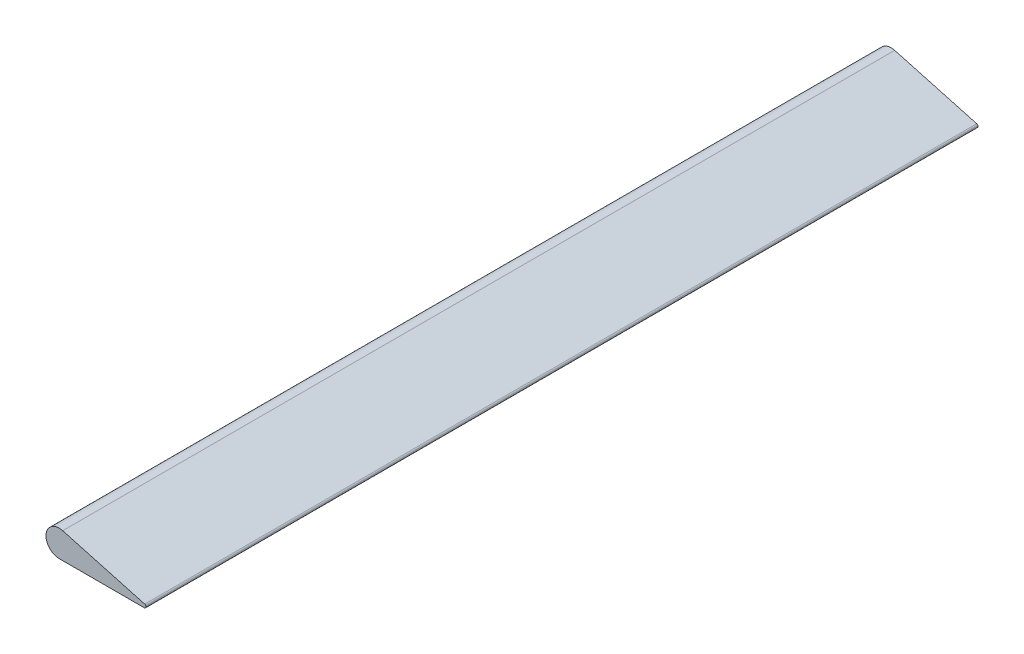
ISO-10303-21;
HEADER;
FILE_DESCRIPTION(('STEP AP214'),'2;1');
FILE_NAME('part.step','',(''),(''),'','','');
FILE_SCHEMA(('AUTOMOTIVE_DESIGN { 1 0 10303 214 1 1 1 1 }'));
ENDSEC;
DATA;
#1=APPLICATION_CONTEXT('core data for automotive mechanical design processes');
#2=APPLICATION_PROTOCOL_DEFINITION('international standard','automotive_design',2000,#1);
#3=PRODUCT_CONTEXT('',#1,'mechanical');
#4=PRODUCT('Part','Part','',(#3));
#5=PRODUCT_RELATED_PRODUCT_CATEGORY('part','',(#4));
#6=PRODUCT_DEFINITION_FORMATION('','',#4);
#7=PRODUCT_DEFINITION_CONTEXT('part definition',#1,'design');
#8=PRODUCT_DEFINITION('design','',#6,#7);
#9=PRODUCT_DEFINITION_SHAPE('','',#8);
#10=(LENGTH_UNIT() NAMED_UNIT(*) SI_UNIT(.MILLI.,.METRE.));
#11=(NAMED_UNIT(*) PLANE_ANGLE_UNIT() SI_UNIT($,.RADIAN.));
#12=(NAMED_UNIT(*) SI_UNIT($,.STERADIAN.) SOLID_ANGLE_UNIT());
#13=UNCERTAINTY_MEASURE_WITH_UNIT(LENGTH_MEASURE(1.E-05),#10,'distance_accuracy_value','');
#14=(GEOMETRIC_REPRESENTATION_CONTEXT(3) GLOBAL_UNCERTAINTY_ASSIGNED_CONTEXT((#13)) GLOBAL_UNIT_ASSIGNED_CONTEXT((#10,
#11,#12)) REPRESENTATION_CONTEXT('',''));
#15=CARTESIAN_POINT('',(0.,0.,0.));
#16=DIRECTION('',(0.,0.,1.));
#17=DIRECTION('',(1.,0.,0.));
#18=AXIS2_PLACEMENT_3D('',#15,#16,#17);
#19=CARTESIAN_POINT('',(446.391965644805,23.8886475423635,235.));
#20=DIRECTION('',(0.,0.,-1.));
#21=DIRECTION('',(-1.,0.,0.));
#22=AXIS2_PLACEMENT_3D('',#19,#20,#21);
#23=CYLINDRICAL_SURFACE('',#22,3.77619516282727);
#24=DIRECTION('',(0.,0.,-1.));
#25=VECTOR('',#24,1.);
#26=CARTESIAN_POINT('',(442.646192423976,23.4102827381828,235.));
#27=LINE('',#26,#25);
#28=CARTESIAN_POINT('',(442.646192423976,23.4102827381828,190.));
#29=VERTEX_POINT('',#28);
#30=CARTESIAN_POINT('',(442.646192423976,23.4102827381828,175.));
#31=VERTEX_POINT('',#30);
#32=EDGE_CURVE('E161',#29,#31,#27,.T.);
#33=ORIENTED_EDGE('',*,*,#32,.F.);
#34=CARTESIAN_POINT('',(446.391965644805,23.8886475423635,190.));
#35=DIRECTION('',(0.,0.,1.));
#36=DIRECTION('',(0.,-1.,0.));
#37=AXIS2_PLACEMENT_3D('',#34,#35,#36);
#38=CIRCLE('',#37,3.77619516282727);
#39=CARTESIAN_POINT('',(446.391965644805,20.1124523795362,190.));
#40=VERTEX_POINT('',#39);
#41=EDGE_CURVE('E185',#29,#40,#38,.T.);
#42=ORIENTED_EDGE('',*,*,#41,.T.);
#43=DIRECTION('',(0.,0.,-1.));
#44=VECTOR('',#43,1.);
#45=CARTESIAN_POINT('',(446.391965644805,20.1124523795362,235.));
#46=LINE('',#45,#44);
#47=CARTESIAN_POINT('',(446.391965644805,20.1124523795362,235.));
#48=VERTEX_POINT('',#47);
#49=EDGE_CURVE('E206',#48,#40,#46,.T.);
#50=ORIENTED_EDGE('',*,*,#49,.F.);
#51=CARTESIAN_POINT('',(446.391965644805,23.8886475423635,235.));
#52=DIRECTION('',(0.,0.,1.));
#53=DIRECTION('',(1.,0.,0.));
#54=AXIS2_PLACEMENT_3D('',#51,#52,#53);
#55=CIRCLE('',#54,3.77619516282727);
#56=CARTESIAN_POINT('',(447.390900991776,27.53031997139,235.));
#57=VERTEX_POINT('',#56);
#58=EDGE_CURVE('E189',#57,#48,#55,.T.);
#59=ORIENTED_EDGE('',*,*,#58,.F.);
#60=DIRECTION('',(0.,0.,-1.));
#61=VECTOR('',#60,1.);
#62=CARTESIAN_POINT('',(447.390900991776,27.53031997139,235.));
#63=LINE('',#62,#61);
#64=CARTESIAN_POINT('',(447.390900991776,27.53031997139,-3.00000000000022));
#65=VERTEX_POINT('',#64);
#66=EDGE_CURVE('E198',#57,#65,#63,.T.);
#67=ORIENTED_EDGE('',*,*,#66,.T.);
#68=CARTESIAN_POINT('',(446.391965644805,23.8886475423635,-3.00000000000022));
#69=DIRECTION('',(0.,0.,1.));
#70=DIRECTION('',(1.,0.,0.));
#71=AXIS2_PLACEMENT_3D('',#68,#69,#70);
#72=CIRCLE('',#71,3.77619516282727);
#73=CARTESIAN_POINT('',(446.391965644805,20.1124523795362,-3.00000000000022));
#74=VERTEX_POINT('',#73);
#75=EDGE_CURVE('E188',#65,#74,#72,.T.);
#76=ORIENTED_EDGE('',*,*,#75,.T.);
#77=CARTESIAN_POINT('',(446.391965644805,20.1124523795362,41.9999999999998));
#78=VERTEX_POINT('',#77);
#79=EDGE_CURVE('E172',#78,#74,#46,.T.);
#80=ORIENTED_EDGE('',*,*,#79,.F.);
#81=CARTESIAN_POINT('',(446.391965644805,23.8886475423635,41.9999999999998));
#82=DIRECTION('',(0.,0.,-1.));
#83=DIRECTION('',(-1.,0.,0.));
#84=AXIS2_PLACEMENT_3D('',#81,#82,#83);
#85=CIRCLE('',#84,3.77619516282727);
#86=CARTESIAN_POINT('',(442.646192423976,23.4102827381828,41.9999999999998));
#87=VERTEX_POINT('',#86);
#88=EDGE_CURVE('E166',#78,#87,#85,.T.);
#89=ORIENTED_EDGE('',*,*,#88,.T.);
#90=DIRECTION('',(0.,0.,-1.));
#91=VECTOR('',#90,1.);
#92=CARTESIAN_POINT('',(442.646192423976,23.4102827381828,235.));
#93=LINE('',#92,#91);
#94=CARTESIAN_POINT('',(442.646192423976,23.4102827381828,56.9999999999998));
#95=VERTEX_POINT('',#94);
#96=EDGE_CURVE('E150',#87,#95,#93,.F.);
#97=ORIENTED_EDGE('',*,*,#96,.T.);
#98=CARTESIAN_POINT('',(446.391965644805,23.8886475423635,56.9999999999998));
#99=DIRECTION('',(0.,0.,1.));
#100=DIRECTION('',(0.,-1.,0.));
#101=AXIS2_PLACEMENT_3D('',#98,#99,#100);
#102=CIRCLE('',#101,3.77619516282727);
#103=CARTESIAN_POINT('',(446.391965644805,20.1124523795362,56.9999999999998));
#104=VERTEX_POINT('',#103);
#105=EDGE_CURVE('E173',#95,#104,#102,.T.);
#106=ORIENTED_EDGE('',*,*,#105,.T.);
#107=CARTESIAN_POINT('',(446.391965644805,20.1124523795362,175.));
#108=VERTEX_POINT('',#107);
#109=EDGE_CURVE('E210',#108,#104,#46,.T.);
#110=ORIENTED_EDGE('',*,*,#109,.F.);
#111=CARTESIAN_POINT('',(446.391965644805,23.8886475423635,175.));
#112=DIRECTION('',(0.,0.,-1.));
#113=DIRECTION('',(0.,1.,0.));
#114=AXIS2_PLACEMENT_3D('',#111,#112,#113);
#115=CIRCLE('',#114,3.77619516282727);
#116=EDGE_CURVE('E176',#108,#31,#115,.T.);
#117=ORIENTED_EDGE('',*,*,#116,.T.);
#118=EDGE_LOOP('',(#33,#42,#50,#59,#67,#76,#80,#89,#97,#106,#110,#117));
#119=FACE_BOUND('',#118,.T.);
#120=ADVANCED_FACE('F39',(#119),#23,.T.);
#121=CARTESIAN_POINT('',(446.391965644805,20.1124523795362,235.));
#122=DIRECTION('',(0.,1.,0.));
#123=DIRECTION('',(-1.,0.,0.));
#124=AXIS2_PLACEMENT_3D('',#121,#122,#123);
#125=PLANE('',#124);
#126=DIRECTION('',(1.,0.,0.));
#127=VECTOR('',#126,1.);
#128=CARTESIAN_POINT('',(446.391965644805,20.1124523795362,-3.00000000000022));
#129=LINE('',#128,#127);
#130=CARTESIAN_POINT('',(470.720248748028,20.1124523795362,-3.00000000000022));
#131=VERTEX_POINT('',#130);
#132=EDGE_CURVE('E200',#74,#131,#129,.T.);
#133=ORIENTED_EDGE('',*,*,#132,.T.);
#134=DIRECTION('',(0.,0.,-1.));
#135=VECTOR('',#134,1.);
#136=CARTESIAN_POINT('',(470.720248748028,20.1124523795362,235.));
#137=LINE('',#136,#135);
#138=CARTESIAN_POINT('',(470.720248748028,20.1124523795362,235.));
#139=VERTEX_POINT('',#138);
#140=EDGE_CURVE('E230',#131,#139,#137,.F.);
#141=ORIENTED_EDGE('',*,*,#140,.T.);
#142=DIRECTION('',(1.,0.,0.));
#143=VECTOR('',#142,1.);
#144=CARTESIAN_POINT('',(446.391965644805,20.1124523795362,235.));
#145=LINE('',#144,#143);
#146=EDGE_CURVE('E192',#48,#139,#145,.T.);
#147=ORIENTED_EDGE('',*,*,#146,.F.);
#148=ORIENTED_EDGE('',*,*,#49,.T.);
#149=DIRECTION('',(1.,0.,0.));
#150=VECTOR('',#149,1.);
#151=CARTESIAN_POINT('',(446.391965644805,20.1124523795362,190.));
#152=LINE('',#151,#150);
#153=CARTESIAN_POINT('',(454.615770481978,20.1124523795362,190.));
#154=VERTEX_POINT('',#153);
#155=EDGE_CURVE('E162',#40,#154,#152,.T.);
#156=ORIENTED_EDGE('',*,*,#155,.T.);
#157=CARTESIAN_POINT('',(454.615770481978,20.1124523795362,187.));
#158=DIRECTION('',(0.,1.,0.));
#159=DIRECTION('',(-1.,0.,0.));
#160=AXIS2_PLACEMENT_3D('',#157,#158,#159);
#161=CIRCLE('',#160,3.);
#162=CARTESIAN_POINT('',(457.615770481978,20.1124523795362,187.));
#163=VERTEX_POINT('',#162);
#164=EDGE_CURVE('E263',#154,#163,#161,.T.);
#165=ORIENTED_EDGE('',*,*,#164,.T.);
#166=DIRECTION('',(0.,0.,-1.));
#167=VECTOR('',#166,1.);
#168=CARTESIAN_POINT('',(457.615770481978,20.1124523795362,235.));
#169=LINE('',#168,#167);
#170=CARTESIAN_POINT('',(457.615770481978,20.1124523795362,178.));
#171=VERTEX_POINT('',#170);
#172=EDGE_CURVE('E219',#163,#171,#169,.T.);
#173=ORIENTED_EDGE('',*,*,#172,.T.);
#174=CARTESIAN_POINT('',(454.615770481978,20.1124523795362,178.));
#175=DIRECTION('',(0.,1.,0.));
#176=DIRECTION('',(-1.,0.,0.));
#177=AXIS2_PLACEMENT_3D('',#174,#175,#176);
#178=CIRCLE('',#177,3.);
#179=CARTESIAN_POINT('',(454.615770481978,20.1124523795362,175.));
#180=VERTEX_POINT('',#179);
#181=EDGE_CURVE('E261',#171,#180,#178,.T.);
#182=ORIENTED_EDGE('',*,*,#181,.T.);
#183=DIRECTION('',(-1.,0.,0.));
#184=VECTOR('',#183,1.);
#185=CARTESIAN_POINT('',(446.391965644805,20.1124523795362,175.));
#186=LINE('',#185,#184);
#187=EDGE_CURVE('E217',#180,#108,#186,.T.);
#188=ORIENTED_EDGE('',*,*,#187,.T.);
#189=ORIENTED_EDGE('',*,*,#109,.T.);
#190=DIRECTION('',(1.,0.,0.));
#191=VECTOR('',#190,1.);
#192=CARTESIAN_POINT('',(446.391965644805,20.1124523795362,56.9999999999998));
#193=LINE('',#192,#191);
#194=CARTESIAN_POINT('',(454.615770481978,20.1124523795362,56.9999999999998));
#195=VERTEX_POINT('',#194);
#196=EDGE_CURVE('E214',#104,#195,#193,.T.);
#197=ORIENTED_EDGE('',*,*,#196,.T.);
#198=CARTESIAN_POINT('',(454.615770481978,20.1124523795362,53.9999999999998));
#199=DIRECTION('',(0.,1.,0.));
#200=DIRECTION('',(-1.,0.,0.));
#201=AXIS2_PLACEMENT_3D('',#198,#199,#200);
#202=CIRCLE('',#201,3.);
#203=CARTESIAN_POINT('',(457.615770481978,20.1124523795362,53.9999999999998));
#204=VERTEX_POINT('',#203);
#205=EDGE_CURVE('E47',#195,#204,#202,.T.);
#206=ORIENTED_EDGE('',*,*,#205,.T.);
#207=DIRECTION('',(0.,0.,-1.));
#208=VECTOR('',#207,1.);
#209=CARTESIAN_POINT('',(457.615770481978,20.1124523795362,235.));
#210=LINE('',#209,#208);
#211=CARTESIAN_POINT('',(457.615770481978,20.1124523795362,44.9999999999998));
#212=VERTEX_POINT('',#211);
#213=EDGE_CURVE('E212',#204,#212,#210,.T.);
#214=ORIENTED_EDGE('',*,*,#213,.T.);
#215=CARTESIAN_POINT('',(454.615770481978,20.1124523795362,44.9999999999998));
#216=DIRECTION('',(0.,1.,0.));
#217=DIRECTION('',(-1.,0.,0.));
#218=AXIS2_PLACEMENT_3D('',#215,#216,#217);
#219=CIRCLE('',#218,3.);
#220=CARTESIAN_POINT('',(454.615770481978,20.1124523795362,41.9999999999998));
#221=VERTEX_POINT('',#220);
#222=EDGE_CURVE('E11',#212,#221,#219,.T.);
#223=ORIENTED_EDGE('',*,*,#222,.T.);
#224=DIRECTION('',(-1.,0.,0.));
#225=VECTOR('',#224,1.);
#226=CARTESIAN_POINT('',(446.391965644806,20.1124523795362,41.9999999999998));
#227=LINE('',#226,#225);
#228=EDGE_CURVE('E209',#221,#78,#227,.T.);
#229=ORIENTED_EDGE('',*,*,#228,.T.);
#230=ORIENTED_EDGE('',*,*,#79,.T.);
#231=EDGE_LOOP('',(#133,#141,#147,#148,#156,#165,#173,#182,#188,#189,#197,#206,#214,#223,#229,#230));
#232=FACE_BOUND('',#231,.T.);
#233=ADVANCED_FACE('F265',(#232),#125,.F.);
#234=CARTESIAN_POINT('',(474.433135480061,20.1124523795362,235.));
#235=DIRECTION('',(-0.264534883367365,-0.964376117229069,0.));
#236=DIRECTION('',(0.964376117229069,-0.264534883367365,0.));
#237=AXIS2_PLACEMENT_3D('',#234,#235,#236);
#238=PLANE('',#237);
#239=DIRECTION('',(-0.964376117229069,0.264534883367365,0.));
#240=VECTOR('',#239,1.);
#241=CARTESIAN_POINT('',(474.433135480061,20.1124523795362,235.));
#242=LINE('',#241,#240);
#243=CARTESIAN_POINT('',(470.852516189712,21.0946404381507,235.));
#244=VERTEX_POINT('',#243);
#245=EDGE_CURVE('E196',#244,#57,#242,.T.);
#246=ORIENTED_EDGE('',*,*,#245,.F.);
#247=DIRECTION('',(0.,0.,-1.));
#248=VECTOR('',#247,1.);
#249=CARTESIAN_POINT('',(470.852516189712,21.0946404381507,235.));
#250=LINE('',#249,#248);
#251=CARTESIAN_POINT('',(470.852516189712,21.0946404381507,-3.00000000000022));
#252=VERTEX_POINT('',#251);
#253=EDGE_CURVE('E225',#244,#252,#250,.T.);
#254=ORIENTED_EDGE('',*,*,#253,.T.);
#255=DIRECTION('',(-0.964376117229069,0.264534883367365,0.));
#256=VECTOR('',#255,1.);
#257=CARTESIAN_POINT('',(474.433135480061,20.1124523795362,-3.00000000000022));
#258=LINE('',#257,#256);
#259=EDGE_CURVE('E193',#252,#65,#258,.T.);
#260=ORIENTED_EDGE('',*,*,#259,.T.);
#261=ORIENTED_EDGE('',*,*,#66,.F.);
#262=EDGE_LOOP('',(#246,#254,#260,#261));
#263=FACE_BOUND('',#262,.T.);
#264=ADVANCED_FACE('F320',(#263),#238,.F.);
#265=CARTESIAN_POINT('',(446.391965644805,23.8886475423635,235.));
#266=DIRECTION('',(0.,0.,1.));
#267=DIRECTION('',(1.,0.,0.));
#268=AXIS2_PLACEMENT_3D('',#265,#266,#267);
#269=PLANE('',#268);
#270=ORIENTED_EDGE('',*,*,#146,.T.);
#271=CARTESIAN_POINT('',(470.720248748028,20.6124523795362,235.));
#272=DIRECTION('',(0.,0.,1.));
#273=DIRECTION('',(1.,0.,0.));
#274=AXIS2_PLACEMENT_3D('',#271,#272,#273);
#275=CIRCLE('',#274,0.5);
#276=EDGE_CURVE('E232',#139,#244,#275,.T.);
#277=ORIENTED_EDGE('',*,*,#276,.T.);
#278=ORIENTED_EDGE('',*,*,#245,.T.);
#279=ORIENTED_EDGE('',*,*,#58,.T.);
#280=EDGE_LOOP('',(#270,#277,#278,#279));
#281=FACE_BOUND('',#280,.T.);
#282=ADVANCED_FACE('F326',(#281),#269,.T.);
#283=CARTESIAN_POINT('',(446.391965644805,23.8886475423635,-3.00000000000022));
#284=DIRECTION('',(0.,0.,1.));
#285=DIRECTION('',(1.,0.,0.));
#286=AXIS2_PLACEMENT_3D('',#283,#284,#285);
#287=PLANE('',#286);
#288=ORIENTED_EDGE('',*,*,#259,.F.);
#289=CARTESIAN_POINT('',(470.720248748028,20.6124523795362,-3.00000000000022));
#290=DIRECTION('',(0.,0.,1.));
#291=DIRECTION('',(1.,0.,0.));
#292=AXIS2_PLACEMENT_3D('',#289,#290,#291);
#293=CIRCLE('',#292,0.5);
#294=EDGE_CURVE('E228',#252,#131,#293,.F.);
#295=ORIENTED_EDGE('',*,*,#294,.T.);
#296=ORIENTED_EDGE('',*,*,#132,.F.);
#297=ORIENTED_EDGE('',*,*,#75,.F.);
#298=EDGE_LOOP('',(#288,#295,#296,#297));
#299=FACE_BOUND('',#298,.T.);
#300=ADVANCED_FACE('F316',(#299),#287,.F.);
#301=CARTESIAN_POINT('',(0.,23.4102827381828,0.));
#302=DIRECTION('',(0.,1.,0.));
#303=DIRECTION('',(0.,0.,1.));
#304=AXIS2_PLACEMENT_3D('',#301,#302,#303);
#305=PLANE('',#304);
#306=DIRECTION('',(0.,0.,1.));
#307=VECTOR('',#306,1.);
#308=CARTESIAN_POINT('',(457.615770481978,23.4102827381828,41.9999999999998));
#309=LINE('',#308,#307);
#310=CARTESIAN_POINT('',(457.615770481978,23.4102827381828,44.9999999999998));
#311=VERTEX_POINT('',#310);
#312=CARTESIAN_POINT('',(457.615770481978,23.4102827381828,53.9999999999998));
#313=VERTEX_POINT('',#312);
#314=EDGE_CURVE('E168',#311,#313,#309,.T.);
#315=ORIENTED_EDGE('',*,*,#314,.T.);
#316=CARTESIAN_POINT('',(454.615770481978,23.4102827381828,53.9999999999998));
#317=DIRECTION('',(0.,1.,0.));
#318=DIRECTION('',(0.,0.,1.));
#319=AXIS2_PLACEMENT_3D('',#316,#317,#318);
#320=CIRCLE('',#319,3.);
#321=CARTESIAN_POINT('',(454.615770481978,23.4102827381828,56.9999999999998));
#322=VERTEX_POINT('',#321);
#323=EDGE_CURVE('E258',#313,#322,#320,.F.);
#324=ORIENTED_EDGE('',*,*,#323,.T.);
#325=DIRECTION('',(-1.,0.,0.));
#326=VECTOR('',#325,1.);
#327=CARTESIAN_POINT('',(442.615770481978,23.4102827381828,56.9999999999998));
#328=LINE('',#327,#326);
#329=EDGE_CURVE('E156',#322,#95,#328,.T.);
#330=ORIENTED_EDGE('',*,*,#329,.T.);
#331=ORIENTED_EDGE('',*,*,#96,.F.);
#332=DIRECTION('',(1.,0.,0.));
#333=VECTOR('',#332,1.);
#334=CARTESIAN_POINT('',(442.615770481978,23.4102827381828,41.9999999999998));
#335=LINE('',#334,#333);
#336=CARTESIAN_POINT('',(454.615770481978,23.4102827381828,41.9999999999998));
#337=VERTEX_POINT('',#336);
#338=EDGE_CURVE('E153',#87,#337,#335,.T.);
#339=ORIENTED_EDGE('',*,*,#338,.T.);
#340=CARTESIAN_POINT('',(454.615770481978,23.4102827381828,44.9999999999998));
#341=DIRECTION('',(0.,1.,0.));
#342=DIRECTION('',(0.,0.,1.));
#343=AXIS2_PLACEMENT_3D('',#340,#341,#342);
#344=CIRCLE('',#343,3.);
#345=EDGE_CURVE('E256',#337,#311,#344,.F.);
#346=ORIENTED_EDGE('',*,*,#345,.T.);
#347=EDGE_LOOP('',(#315,#324,#330,#331,#339,#346));
#348=FACE_BOUND('',#347,.T.);
#349=ADVANCED_FACE('F152',(#348),#305,.F.);
#350=CARTESIAN_POINT('',(442.615770481978,23.4102827381828,56.9999999999998));
#351=DIRECTION('',(0.,0.,1.));
#352=DIRECTION('',(0.,-1.,0.));
#353=AXIS2_PLACEMENT_3D('',#350,#351,#352);
#354=PLANE('',#353);
#355=ORIENTED_EDGE('',*,*,#329,.F.);
#356=DIRECTION('',(0.,-1.,0.));
#357=VECTOR('',#356,1.);
#358=CARTESIAN_POINT('',(454.615770481978,20.1124523795362,56.9999999999998));
#359=LINE('',#358,#357);
#360=EDGE_CURVE('E248',#322,#195,#359,.T.);
#361=ORIENTED_EDGE('',*,*,#360,.T.);
#362=ORIENTED_EDGE('',*,*,#196,.F.);
#363=ORIENTED_EDGE('',*,*,#105,.F.);
#364=EDGE_LOOP('',(#355,#361,#362,#363));
#365=FACE_BOUND('',#364,.T.);
#366=ADVANCED_FACE('F277',(#365),#354,.F.);
#367=CARTESIAN_POINT('',(457.615770481978,23.4102827381828,41.9999999999998));
#368=DIRECTION('',(1.,0.,0.));
#369=DIRECTION('',(0.,0.,-1.));
#370=AXIS2_PLACEMENT_3D('',#367,#368,#369);
#371=PLANE('',#370);
#372=ORIENTED_EDGE('',*,*,#213,.F.);
#373=DIRECTION('',(0.,-1.,0.));
#374=VECTOR('',#373,1.);
#375=CARTESIAN_POINT('',(457.615770481978,23.4102827381828,53.9999999999998));
#376=LINE('',#375,#374);
#377=EDGE_CURVE('E254',#204,#313,#376,.F.);
#378=ORIENTED_EDGE('',*,*,#377,.T.);
#379=ORIENTED_EDGE('',*,*,#314,.F.);
#380=DIRECTION('',(0.,-1.,0.));
#381=VECTOR('',#380,1.);
#382=CARTESIAN_POINT('',(457.615770481978,20.1124523795362,44.9999999999998));
#383=LINE('',#382,#381);
#384=EDGE_CURVE('E251',#311,#212,#383,.T.);
#385=ORIENTED_EDGE('',*,*,#384,.T.);
#386=EDGE_LOOP('',(#372,#378,#379,#385));
#387=FACE_BOUND('',#386,.T.);
#388=ADVANCED_FACE('F271',(#387),#371,.F.);
#389=CARTESIAN_POINT('',(442.615770481978,23.4102827381828,41.9999999999998));
#390=DIRECTION('',(0.,0.,-1.));
#391=DIRECTION('',(-1.,0.,0.));
#392=AXIS2_PLACEMENT_3D('',#389,#390,#391);
#393=PLANE('',#392);
#394=ORIENTED_EDGE('',*,*,#228,.F.);
#395=DIRECTION('',(0.,-1.,0.));
#396=VECTOR('',#395,1.);
#397=CARTESIAN_POINT('',(454.615770481978,23.4102827381828,41.9999999999998));
#398=LINE('',#397,#396);
#399=EDGE_CURVE('E59',#221,#337,#398,.F.);
#400=ORIENTED_EDGE('',*,*,#399,.T.);
#401=ORIENTED_EDGE('',*,*,#338,.F.);
#402=ORIENTED_EDGE('',*,*,#88,.F.);
#403=EDGE_LOOP('',(#394,#400,#401,#402));
#404=FACE_BOUND('',#403,.T.);
#405=ADVANCED_FACE('F165',(#404),#393,.F.);
#406=CARTESIAN_POINT('',(0.,23.4102827381828,0.));
#407=DIRECTION('',(0.,-1.,0.));
#408=DIRECTION('',(0.,0.,-1.));
#409=AXIS2_PLACEMENT_3D('',#406,#407,#408);
#410=PLANE('',#409);
#411=DIRECTION('',(1.,0.,0.));
#412=VECTOR('',#411,1.);
#413=CARTESIAN_POINT('',(442.615770481978,23.4102827381828,175.));
#414=LINE('',#413,#412);
#415=CARTESIAN_POINT('',(454.615770481978,23.4102827381828,175.));
#416=VERTEX_POINT('',#415);
#417=EDGE_CURVE('E278',#31,#416,#414,.T.);
#418=ORIENTED_EDGE('',*,*,#417,.T.);
#419=CARTESIAN_POINT('',(454.615770481978,23.4102827381828,178.));
#420=DIRECTION('',(0.,-1.,0.));
#421=DIRECTION('',(0.,0.,-1.));
#422=AXIS2_PLACEMENT_3D('',#419,#420,#421);
#423=CIRCLE('',#422,3.);
#424=CARTESIAN_POINT('',(457.615770481978,23.4102827381828,178.));
#425=VERTEX_POINT('',#424);
#426=EDGE_CURVE('E243',#416,#425,#423,.T.);
#427=ORIENTED_EDGE('',*,*,#426,.T.);
#428=DIRECTION('',(0.,0.,1.));
#429=VECTOR('',#428,1.);
#430=CARTESIAN_POINT('',(457.615770481978,23.4102827381828,190.));
#431=LINE('',#430,#429);
#432=CARTESIAN_POINT('',(457.615770481978,23.4102827381828,187.));
#433=VERTEX_POINT('',#432);
#434=EDGE_CURVE('E178',#425,#433,#431,.T.);
#435=ORIENTED_EDGE('',*,*,#434,.T.);
#436=CARTESIAN_POINT('',(454.615770481978,23.4102827381828,187.));
#437=DIRECTION('',(0.,-1.,0.));
#438=DIRECTION('',(0.,0.,-1.));
#439=AXIS2_PLACEMENT_3D('',#436,#437,#438);
#440=CIRCLE('',#439,3.);
#441=CARTESIAN_POINT('',(454.615770481978,23.4102827381828,190.));
#442=VERTEX_POINT('',#441);
#443=EDGE_CURVE('E241',#433,#442,#440,.T.);
#444=ORIENTED_EDGE('',*,*,#443,.T.);
#445=DIRECTION('',(-1.,0.,0.));
#446=VECTOR('',#445,1.);
#447=CARTESIAN_POINT('',(442.615770481978,23.4102827381828,190.));
#448=LINE('',#447,#446);
#449=EDGE_CURVE('E174',#442,#29,#448,.T.);
#450=ORIENTED_EDGE('',*,*,#449,.T.);
#451=ORIENTED_EDGE('',*,*,#32,.T.);
#452=EDGE_LOOP('',(#418,#427,#435,#444,#450,#451));
#453=FACE_BOUND('',#452,.T.);
#454=ADVANCED_FACE('F286',(#453),#410,.T.);
#455=CARTESIAN_POINT('',(442.615770481978,23.4102827381828,190.));
#456=DIRECTION('',(0.,0.,1.));
#457=DIRECTION('',(0.,-1.,0.));
#458=AXIS2_PLACEMENT_3D('',#455,#456,#457);
#459=PLANE('',#458);
#460=ORIENTED_EDGE('',*,*,#449,.F.);
#461=DIRECTION('',(0.,-1.,0.));
#462=VECTOR('',#461,1.);
#463=CARTESIAN_POINT('',(454.615770481978,20.1124523795362,190.));
#464=LINE('',#463,#462);
#465=EDGE_CURVE('E245',#442,#154,#464,.T.);
#466=ORIENTED_EDGE('',*,*,#465,.T.);
#467=ORIENTED_EDGE('',*,*,#155,.F.);
#468=ORIENTED_EDGE('',*,*,#41,.F.);
#469=EDGE_LOOP('',(#460,#466,#467,#468));
#470=FACE_BOUND('',#469,.T.);
#471=ADVANCED_FACE('F296',(#470),#459,.F.);
#472=CARTESIAN_POINT('',(457.615770481978,23.4102827381828,190.));
#473=DIRECTION('',(1.,0.,0.));
#474=DIRECTION('',(0.,0.,-1.));
#475=AXIS2_PLACEMENT_3D('',#472,#473,#474);
#476=PLANE('',#475);
#477=ORIENTED_EDGE('',*,*,#434,.F.);
#478=DIRECTION('',(0.,-1.,0.));
#479=VECTOR('',#478,1.);
#480=CARTESIAN_POINT('',(457.615770481978,20.1124523795362,178.));
#481=LINE('',#480,#479);
#482=EDGE_CURVE('E236',#425,#171,#481,.T.);
#483=ORIENTED_EDGE('',*,*,#482,.T.);
#484=ORIENTED_EDGE('',*,*,#172,.F.);
#485=DIRECTION('',(0.,-1.,0.));
#486=VECTOR('',#485,1.);
#487=CARTESIAN_POINT('',(457.615770481978,23.4102827381828,187.));
#488=LINE('',#487,#486);
#489=EDGE_CURVE('E234',#163,#433,#488,.F.);
#490=ORIENTED_EDGE('',*,*,#489,.T.);
#491=EDGE_LOOP('',(#477,#483,#484,#490));
#492=FACE_BOUND('',#491,.T.);
#493=ADVANCED_FACE('F310',(#492),#476,.F.);
#494=CARTESIAN_POINT('',(442.615770481978,23.4102827381828,175.));
#495=DIRECTION('',(0.,0.,-1.));
#496=DIRECTION('',(0.,1.,0.));
#497=AXIS2_PLACEMENT_3D('',#494,#495,#496);
#498=PLANE('',#497);
#499=ORIENTED_EDGE('',*,*,#187,.F.);
#500=DIRECTION('',(0.,-1.,0.));
#501=VECTOR('',#500,1.);
#502=CARTESIAN_POINT('',(454.615770481978,23.4102827381828,175.));
#503=LINE('',#502,#501);
#504=EDGE_CURVE('E239',#180,#416,#503,.F.);
#505=ORIENTED_EDGE('',*,*,#504,.T.);
#506=ORIENTED_EDGE('',*,*,#417,.F.);
#507=ORIENTED_EDGE('',*,*,#116,.F.);
#508=EDGE_LOOP('',(#499,#505,#506,#507));
#509=FACE_BOUND('',#508,.T.);
#510=ADVANCED_FACE('F306',(#509),#498,.F.);
#511=CARTESIAN_POINT('',(470.720248748028,20.6124523795362,235.));
#512=DIRECTION('',(0.,0.,-1.));
#513=DIRECTION('',(-1.,0.,0.));
#514=AXIS2_PLACEMENT_3D('',#511,#512,#513);
#515=CYLINDRICAL_SURFACE('',#514,0.5);
#516=ORIENTED_EDGE('',*,*,#276,.F.);
#517=ORIENTED_EDGE('',*,*,#140,.F.);
#518=ORIENTED_EDGE('',*,*,#294,.F.);
#519=ORIENTED_EDGE('',*,*,#253,.F.);
#520=EDGE_LOOP('',(#516,#517,#518,#519));
#521=FACE_BOUND('',#520,.T.);
#522=ADVANCED_FACE('F324',(#521),#515,.T.);
#523=CARTESIAN_POINT('',(454.615770481978,23.4102827381828,178.));
#524=DIRECTION('',(0.,1.,0.));
#525=DIRECTION('',(0.,0.,1.));
#526=AXIS2_PLACEMENT_3D('',#523,#524,#525);
#527=CYLINDRICAL_SURFACE('',#526,3.);
#528=ORIENTED_EDGE('',*,*,#426,.F.);
#529=ORIENTED_EDGE('',*,*,#504,.F.);
#530=ORIENTED_EDGE('',*,*,#181,.F.);
#531=ORIENTED_EDGE('',*,*,#482,.F.);
#532=EDGE_LOOP('',(#528,#529,#530,#531));
#533=FACE_BOUND('',#532,.T.);
#534=ADVANCED_FACE('F309',(#533),#527,.F.);
#535=CARTESIAN_POINT('',(454.615770481978,23.4102827381828,187.));
#536=DIRECTION('',(0.,1.,0.));
#537=DIRECTION('',(0.,0.,1.));
#538=AXIS2_PLACEMENT_3D('',#535,#536,#537);
#539=CYLINDRICAL_SURFACE('',#538,3.);
#540=ORIENTED_EDGE('',*,*,#443,.F.);
#541=ORIENTED_EDGE('',*,*,#489,.F.);
#542=ORIENTED_EDGE('',*,*,#164,.F.);
#543=ORIENTED_EDGE('',*,*,#465,.F.);
#544=EDGE_LOOP('',(#540,#541,#542,#543));
#545=FACE_BOUND('',#544,.T.);
#546=ADVANCED_FACE('F294',(#545),#539,.F.);
#547=CARTESIAN_POINT('',(454.615770481978,23.4102827381828,53.9999999999998));
#548=DIRECTION('',(0.,1.,0.));
#549=DIRECTION('',(0.,0.,1.));
#550=AXIS2_PLACEMENT_3D('',#547,#548,#549);
#551=CYLINDRICAL_SURFACE('',#550,3.);
#552=ORIENTED_EDGE('',*,*,#323,.F.);
#553=ORIENTED_EDGE('',*,*,#377,.F.);
#554=ORIENTED_EDGE('',*,*,#205,.F.);
#555=ORIENTED_EDGE('',*,*,#360,.F.);
#556=EDGE_LOOP('',(#552,#553,#554,#555));
#557=FACE_BOUND('',#556,.T.);
#558=ADVANCED_FACE('F275',(#557),#551,.F.);
#559=CARTESIAN_POINT('',(454.615770481978,23.4102827381828,44.9999999999998));
#560=DIRECTION('',(0.,1.,0.));
#561=DIRECTION('',(0.,0.,1.));
#562=AXIS2_PLACEMENT_3D('',#559,#560,#561);
#563=CYLINDRICAL_SURFACE('',#562,3.);
#564=ORIENTED_EDGE('',*,*,#345,.F.);
#565=ORIENTED_EDGE('',*,*,#399,.F.);
#566=ORIENTED_EDGE('',*,*,#222,.F.);
#567=ORIENTED_EDGE('',*,*,#384,.F.);
#568=EDGE_LOOP('',(#564,#565,#566,#567));
#569=FACE_BOUND('',#568,.T.);
#570=ADVANCED_FACE('F41',(#569),#563,.F.);
#571=CLOSED_SHELL('',(#120,#233,#264,#282,#300,#349,#366,#388,#405,#454,#471,#493,#510,#522,
#534,#546,#558,#570));
#572=MANIFOLD_SOLID_BREP('B2',#571);
#573=ADVANCED_BREP_SHAPE_REPRESENTATION('',(#18,#572),#14);
#574=SHAPE_DEFINITION_REPRESENTATION(#9,#573);
ENDSEC;
END-ISO-10303-21;
